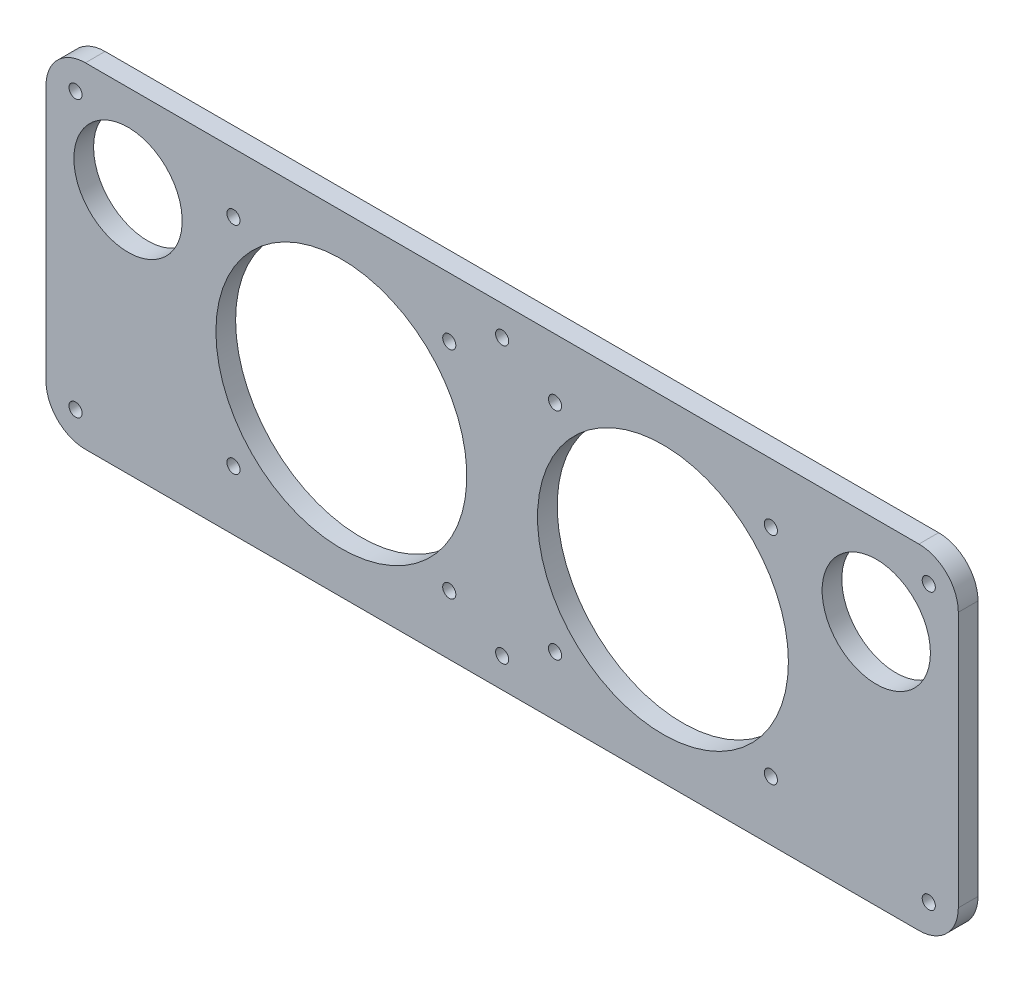
ISO-10303-21;
HEADER;
FILE_DESCRIPTION(('STEP AP214'),'2;1');
FILE_NAME('part.step','',(''),(''),'','','');
FILE_SCHEMA(('AUTOMOTIVE_DESIGN { 1 0 10303 214 1 1 1 1 }'));
ENDSEC;
DATA;
#1=APPLICATION_CONTEXT('core data for automotive mechanical design processes');
#2=APPLICATION_PROTOCOL_DEFINITION('international standard','automotive_design',2000,#1);
#3=PRODUCT_CONTEXT('',#1,'mechanical');
#4=PRODUCT('Part','Part','',(#3));
#5=PRODUCT_RELATED_PRODUCT_CATEGORY('part','',(#4));
#6=PRODUCT_DEFINITION_FORMATION('','',#4);
#7=PRODUCT_DEFINITION_CONTEXT('part definition',#1,'design');
#8=PRODUCT_DEFINITION('design','',#6,#7);
#9=PRODUCT_DEFINITION_SHAPE('','',#8);
#10=(LENGTH_UNIT() NAMED_UNIT(*) SI_UNIT(.MILLI.,.METRE.));
#11=(NAMED_UNIT(*) PLANE_ANGLE_UNIT() SI_UNIT($,.RADIAN.));
#12=(NAMED_UNIT(*) SI_UNIT($,.STERADIAN.) SOLID_ANGLE_UNIT());
#13=UNCERTAINTY_MEASURE_WITH_UNIT(LENGTH_MEASURE(1.E-05),#10,'distance_accuracy_value','');
#14=(GEOMETRIC_REPRESENTATION_CONTEXT(3) GLOBAL_UNCERTAINTY_ASSIGNED_CONTEXT((#13)) GLOBAL_UNIT_ASSIGNED_CONTEXT((#10,
#11,#12)) REPRESENTATION_CONTEXT('',''));
#15=CARTESIAN_POINT('',(0.,0.,0.));
#16=DIRECTION('',(0.,0.,1.));
#17=DIRECTION('',(1.,0.,0.));
#18=AXIS2_PLACEMENT_3D('',#15,#16,#17);
#19=CARTESIAN_POINT('',(-2.99999999999999,51.,-6.));
#20=DIRECTION('',(0.,1.,0.));
#21=DIRECTION('',(0.,0.,1.));
#22=AXIS2_PLACEMENT_3D('',#19,#20,#21);
#23=PLANE('',#22);
#24=DIRECTION('',(-1.,0.,0.));
#25=VECTOR('',#24,1.);
#26=CARTESIAN_POINT('',(-2.99999999999999,51.,-6.));
#27=LINE('',#26,#25);
#28=CARTESIAN_POINT('',(127.,51.,-6.));
#29=VERTEX_POINT('',#28);
#30=CARTESIAN_POINT('',(-127.,51.,-6.));
#31=VERTEX_POINT('',#30);
#32=EDGE_CURVE('E103',#29,#31,#27,.T.);
#33=ORIENTED_EDGE('',*,*,#32,.T.);
#34=DIRECTION('',(0.,0.,1.));
#35=VECTOR('',#34,1.);
#36=CARTESIAN_POINT('',(-127.,51.,-6.));
#37=LINE('',#36,#35);
#38=CARTESIAN_POINT('',(-127.,51.,0.));
#39=VERTEX_POINT('',#38);
#40=EDGE_CURVE('E109',#31,#39,#37,.T.);
#41=ORIENTED_EDGE('',*,*,#40,.T.);
#42=DIRECTION('',(-1.,0.,0.));
#43=VECTOR('',#42,1.);
#44=CARTESIAN_POINT('',(-2.99999999999999,51.,0.));
#45=LINE('',#44,#43);
#46=CARTESIAN_POINT('',(127.,51.,0.));
#47=VERTEX_POINT('',#46);
#48=EDGE_CURVE('E106',#47,#39,#45,.T.);
#49=ORIENTED_EDGE('',*,*,#48,.F.);
#50=DIRECTION('',(0.,0.,1.));
#51=VECTOR('',#50,1.);
#52=CARTESIAN_POINT('',(127.,51.,-6.));
#53=LINE('',#52,#51);
#54=EDGE_CURVE('E100',#47,#29,#53,.F.);
#55=ORIENTED_EDGE('',*,*,#54,.T.);
#56=EDGE_LOOP('',(#33,#41,#49,#55));
#57=FACE_BOUND('',#56,.T.);
#58=ADVANCED_FACE('F33',(#57),#23,.T.);
#59=CARTESIAN_POINT('',(139.,51.,-6.));
#60=DIRECTION('',(1.,0.,0.));
#61=DIRECTION('',(0.,0.,-1.));
#62=AXIS2_PLACEMENT_3D('',#59,#60,#61);
#63=PLANE('',#62);
#64=DIRECTION('',(0.,1.,0.));
#65=VECTOR('',#64,1.);
#66=CARTESIAN_POINT('',(139.,51.,0.));
#67=LINE('',#66,#65);
#68=CARTESIAN_POINT('',(139.,-39.,0.));
#69=VERTEX_POINT('',#68);
#70=CARTESIAN_POINT('',(139.,39.,0.));
#71=VERTEX_POINT('',#70);
#72=EDGE_CURVE('E139',#69,#71,#67,.T.);
#73=ORIENTED_EDGE('',*,*,#72,.F.);
#74=DIRECTION('',(0.,0.,1.));
#75=VECTOR('',#74,1.);
#76=CARTESIAN_POINT('',(139.,-39.,-6.));
#77=LINE('',#76,#75);
#78=CARTESIAN_POINT('',(139.,-39.,-6.));
#79=VERTEX_POINT('',#78);
#80=EDGE_CURVE('E11',#69,#79,#77,.F.);
#81=ORIENTED_EDGE('',*,*,#80,.T.);
#82=DIRECTION('',(0.,1.,0.));
#83=VECTOR('',#82,1.);
#84=CARTESIAN_POINT('',(139.,51.,-6.));
#85=LINE('',#84,#83);
#86=CARTESIAN_POINT('',(139.,39.,-6.));
#87=VERTEX_POINT('',#86);
#88=EDGE_CURVE('E118',#79,#87,#85,.T.);
#89=ORIENTED_EDGE('',*,*,#88,.T.);
#90=DIRECTION('',(0.,0.,1.));
#91=VECTOR('',#90,1.);
#92=CARTESIAN_POINT('',(139.,39.,-6.));
#93=LINE('',#92,#91);
#94=EDGE_CURVE('E41',#87,#71,#93,.T.);
#95=ORIENTED_EDGE('',*,*,#94,.T.);
#96=EDGE_LOOP('',(#73,#81,#89,#95));
#97=FACE_BOUND('',#96,.T.);
#98=ADVANCED_FACE('F138',(#97),#63,.T.);
#99=CARTESIAN_POINT('',(-2.99999999999999,-51.,-6.));
#100=DIRECTION('',(0.,-1.,0.));
#101=DIRECTION('',(0.,0.,-1.));
#102=AXIS2_PLACEMENT_3D('',#99,#100,#101);
#103=PLANE('',#102);
#104=DIRECTION('',(1.,0.,0.));
#105=VECTOR('',#104,1.);
#106=CARTESIAN_POINT('',(-2.99999999999999,-51.,0.));
#107=LINE('',#106,#105);
#108=CARTESIAN_POINT('',(-127.,-51.,0.));
#109=VERTEX_POINT('',#108);
#110=CARTESIAN_POINT('',(127.,-51.,0.));
#111=VERTEX_POINT('',#110);
#112=EDGE_CURVE('E147',#109,#111,#107,.T.);
#113=ORIENTED_EDGE('',*,*,#112,.F.);
#114=DIRECTION('',(0.,0.,1.));
#115=VECTOR('',#114,1.);
#116=CARTESIAN_POINT('',(-127.,-51.,-6.));
#117=LINE('',#116,#115);
#118=CARTESIAN_POINT('',(-127.,-51.,-6.));
#119=VERTEX_POINT('',#118);
#120=EDGE_CURVE('E55',#109,#119,#117,.F.);
#121=ORIENTED_EDGE('',*,*,#120,.T.);
#122=DIRECTION('',(1.,0.,0.));
#123=VECTOR('',#122,1.);
#124=CARTESIAN_POINT('',(-2.99999999999999,-51.,-6.));
#125=LINE('',#124,#123);
#126=CARTESIAN_POINT('',(127.,-51.,-6.));
#127=VERTEX_POINT('',#126);
#128=EDGE_CURVE('E149',#119,#127,#125,.T.);
#129=ORIENTED_EDGE('',*,*,#128,.T.);
#130=DIRECTION('',(0.,0.,1.));
#131=VECTOR('',#130,1.);
#132=CARTESIAN_POINT('',(127.,-51.,-6.));
#133=LINE('',#132,#131);
#134=EDGE_CURVE('E132',#127,#111,#133,.T.);
#135=ORIENTED_EDGE('',*,*,#134,.T.);
#136=EDGE_LOOP('',(#113,#121,#129,#135));
#137=FACE_BOUND('',#136,.T.);
#138=ADVANCED_FACE('F217',(#137),#103,.T.);
#139=CARTESIAN_POINT('',(0.,0.,-6.));
#140=DIRECTION('',(0.,0.,1.));
#141=DIRECTION('',(1.,0.,0.));
#142=AXIS2_PLACEMENT_3D('',#139,#140,#141);
#143=PLANE('',#142);
#144=CARTESIAN_POINT('',(-130.,42.,-6.));
#145=DIRECTION('',(0.,0.,1.));
#146=DIRECTION('',(1.,0.,0.));
#147=AXIS2_PLACEMENT_3D('',#144,#145,#146);
#148=CIRCLE('',#147,2.);
#149=CARTESIAN_POINT('',(-128.,42.,-6.));
#150=VERTEX_POINT('',#149);
#151=EDGE_CURVE('E309',#150,#150,#148,.T.);
#152=ORIENTED_EDGE('',*,*,#151,.T.);
#153=EDGE_LOOP('',(#152));
#154=FACE_BOUND('',#153,.T.);
#155=CARTESIAN_POINT('',(130.,-42.,-6.));
#156=DIRECTION('',(0.,0.,1.));
#157=DIRECTION('',(1.,0.,0.));
#158=AXIS2_PLACEMENT_3D('',#155,#156,#157);
#159=CIRCLE('',#158,2.);
#160=CARTESIAN_POINT('',(132.,-42.,-6.));
#161=VERTEX_POINT('',#160);
#162=EDGE_CURVE('E313',#161,#161,#159,.T.);
#163=ORIENTED_EDGE('',*,*,#162,.T.);
#164=EDGE_LOOP('',(#163));
#165=FACE_BOUND('',#164,.T.);
#166=CARTESIAN_POINT('',(-130.,-42.,-6.));
#167=DIRECTION('',(0.,0.,1.));
#168=DIRECTION('',(1.,0.,0.));
#169=AXIS2_PLACEMENT_3D('',#166,#167,#168);
#170=CIRCLE('',#169,2.);
#171=CARTESIAN_POINT('',(-128.,-42.,-6.));
#172=VERTEX_POINT('',#171);
#173=EDGE_CURVE('E317',#172,#172,#170,.T.);
#174=ORIENTED_EDGE('',*,*,#173,.T.);
#175=EDGE_LOOP('',(#174));
#176=FACE_BOUND('',#175,.T.);
#177=CARTESIAN_POINT('',(130.,42.,-6.));
#178=DIRECTION('',(0.,0.,1.));
#179=DIRECTION('',(1.,0.,0.));
#180=AXIS2_PLACEMENT_3D('',#177,#178,#179);
#181=CIRCLE('',#180,2.);
#182=CARTESIAN_POINT('',(132.,42.,-6.));
#183=VERTEX_POINT('',#182);
#184=EDGE_CURVE('E321',#183,#183,#181,.T.);
#185=ORIENTED_EDGE('',*,*,#184,.T.);
#186=EDGE_LOOP('',(#185));
#187=FACE_BOUND('',#186,.T.);
#188=CARTESIAN_POINT('',(0.,42.,-6.));
#189=DIRECTION('',(0.,0.,1.));
#190=DIRECTION('',(1.,0.,0.));
#191=AXIS2_PLACEMENT_3D('',#188,#189,#190);
#192=CIRCLE('',#191,2.);
#193=CARTESIAN_POINT('',(2.00000000000001,42.,-6.));
#194=VERTEX_POINT('',#193);
#195=EDGE_CURVE('E325',#194,#194,#192,.T.);
#196=ORIENTED_EDGE('',*,*,#195,.T.);
#197=EDGE_LOOP('',(#196));
#198=FACE_BOUND('',#197,.T.);
#199=CARTESIAN_POINT('',(0.,-42.,-6.));
#200=DIRECTION('',(0.,0.,1.));
#201=DIRECTION('',(1.,0.,0.));
#202=AXIS2_PLACEMENT_3D('',#199,#200,#201);
#203=CIRCLE('',#202,2.);
#204=CARTESIAN_POINT('',(2.00000000000001,-42.,-6.));
#205=VERTEX_POINT('',#204);
#206=EDGE_CURVE('E329',#205,#205,#203,.T.);
#207=ORIENTED_EDGE('',*,*,#206,.T.);
#208=EDGE_LOOP('',(#207));
#209=FACE_BOUND('',#208,.T.);
#210=CARTESIAN_POINT('',(114.,24.,-6.));
#211=DIRECTION('',(0.,0.,1.));
#212=DIRECTION('',(1.,0.,0.));
#213=AXIS2_PLACEMENT_3D('',#210,#211,#212);
#214=CIRCLE('',#213,16.5);
#215=CARTESIAN_POINT('',(130.5,24.,-6.));
#216=VERTEX_POINT('',#215);
#217=EDGE_CURVE('E181',#216,#216,#214,.T.);
#218=ORIENTED_EDGE('',*,*,#217,.T.);
#219=EDGE_LOOP('',(#218));
#220=FACE_BOUND('',#219,.T.);
#221=CARTESIAN_POINT('',(16.1195346748253,32.8804653251742,-6.));
#222=DIRECTION('',(0.,0.,1.));
#223=DIRECTION('',(0.,1.,0.));
#224=AXIS2_PLACEMENT_3D('',#221,#222,#223);
#225=CIRCLE('',#224,2.);
#226=CARTESIAN_POINT('',(16.1195346748252,34.8804653251742,-6.));
#227=VERTEX_POINT('',#226);
#228=EDGE_CURVE('E187',#227,#227,#225,.T.);
#229=ORIENTED_EDGE('',*,*,#228,.T.);
#230=EDGE_LOOP('',(#229));
#231=FACE_BOUND('',#230,.T.);
#232=CARTESIAN_POINT('',(16.1195346748257,-32.8804653251746,-6.));
#233=DIRECTION('',(0.,0.,1.));
#234=DIRECTION('',(-1.,0.,0.));
#235=AXIS2_PLACEMENT_3D('',#232,#233,#234);
#236=CIRCLE('',#235,2.);
#237=CARTESIAN_POINT('',(14.1195346748257,-32.8804653251746,-6.));
#238=VERTEX_POINT('',#237);
#239=EDGE_CURVE('E194',#238,#238,#236,.T.);
#240=ORIENTED_EDGE('',*,*,#239,.T.);
#241=EDGE_LOOP('',(#240));
#242=FACE_BOUND('',#241,.T.);
#243=CARTESIAN_POINT('',(81.880465325175,-32.8804653251739,-6.));
#244=DIRECTION('',(0.,0.,1.));
#245=DIRECTION('',(0.,-1.,0.));
#246=AXIS2_PLACEMENT_3D('',#243,#244,#245);
#247=CIRCLE('',#246,2.);
#248=CARTESIAN_POINT('',(81.880465325175,-34.8804653251739,-6.));
#249=VERTEX_POINT('',#248);
#250=EDGE_CURVE('E200',#249,#249,#247,.T.);
#251=ORIENTED_EDGE('',*,*,#250,.T.);
#252=EDGE_LOOP('',(#251));
#253=FACE_BOUND('',#252,.T.);
#254=CARTESIAN_POINT('',(81.8804653251743,32.8804653251746,-6.));
#255=DIRECTION('',(0.,0.,1.));
#256=DIRECTION('',(1.,0.,0.));
#257=AXIS2_PLACEMENT_3D('',#254,#255,#256);
#258=CIRCLE('',#257,2.);
#259=CARTESIAN_POINT('',(83.8804653251743,32.8804653251746,-6.));
#260=VERTEX_POINT('',#259);
#261=EDGE_CURVE('E205',#260,#260,#258,.T.);
#262=ORIENTED_EDGE('',*,*,#261,.T.);
#263=EDGE_LOOP('',(#262));
#264=FACE_BOUND('',#263,.T.);
#265=CARTESIAN_POINT('',(49.,0.,-6.));
#266=DIRECTION('',(0.,0.,1.));
#267=DIRECTION('',(1.,0.,0.));
#268=AXIS2_PLACEMENT_3D('',#265,#266,#267);
#269=CIRCLE('',#268,38.227);
#270=CARTESIAN_POINT('',(87.227,0.,-6.));
#271=VERTEX_POINT('',#270);
#272=EDGE_CURVE('E151',#271,#271,#269,.T.);
#273=ORIENTED_EDGE('',*,*,#272,.T.);
#274=EDGE_LOOP('',(#273));
#275=FACE_BOUND('',#274,.T.);
#276=DIRECTION('',(0.,1.,0.));
#277=VECTOR('',#276,1.);
#278=CARTESIAN_POINT('',(-139.,51.,-6.));
#279=LINE('',#278,#277);
#280=CARTESIAN_POINT('',(-139.,-39.,-6.));
#281=VERTEX_POINT('',#280);
#282=CARTESIAN_POINT('',(-139.,39.,-6.));
#283=VERTEX_POINT('',#282);
#284=EDGE_CURVE('E169',#281,#283,#279,.T.);
#285=ORIENTED_EDGE('',*,*,#284,.T.);
#286=CARTESIAN_POINT('',(-127.,39.,-6.));
#287=DIRECTION('',(0.,0.,1.));
#288=DIRECTION('',(1.,0.,0.));
#289=AXIS2_PLACEMENT_3D('',#286,#287,#288);
#290=CIRCLE('',#289,12.);
#291=EDGE_CURVE('E117',#283,#31,#290,.F.);
#292=ORIENTED_EDGE('',*,*,#291,.T.);
#293=ORIENTED_EDGE('',*,*,#32,.F.);
#294=CARTESIAN_POINT('',(127.,39.,-6.));
#295=DIRECTION('',(0.,0.,1.));
#296=DIRECTION('',(1.,0.,0.));
#297=AXIS2_PLACEMENT_3D('',#294,#295,#296);
#298=CIRCLE('',#297,12.);
#299=EDGE_CURVE('E114',#29,#87,#298,.F.);
#300=ORIENTED_EDGE('',*,*,#299,.T.);
#301=ORIENTED_EDGE('',*,*,#88,.F.);
#302=CARTESIAN_POINT('',(127.,-39.,-6.));
#303=DIRECTION('',(0.,0.,1.));
#304=DIRECTION('',(1.,0.,0.));
#305=AXIS2_PLACEMENT_3D('',#302,#303,#304);
#306=CIRCLE('',#305,12.);
#307=EDGE_CURVE('E48',#79,#127,#306,.F.);
#308=ORIENTED_EDGE('',*,*,#307,.T.);
#309=ORIENTED_EDGE('',*,*,#128,.F.);
#310=CARTESIAN_POINT('',(-127.,-39.,-6.));
#311=DIRECTION('',(0.,0.,1.));
#312=DIRECTION('',(1.,0.,0.));
#313=AXIS2_PLACEMENT_3D('',#310,#311,#312);
#314=CIRCLE('',#313,12.);
#315=EDGE_CURVE('E124',#119,#281,#314,.F.);
#316=ORIENTED_EDGE('',*,*,#315,.T.);
#317=EDGE_LOOP('',(#285,#292,#293,#300,#301,#308,#309,#316));
#318=FACE_BOUND('',#317,.T.);
#319=CARTESIAN_POINT('',(-114.,24.,-6.));
#320=DIRECTION('',(0.,0.,-1.));
#321=DIRECTION('',(-1.,0.,0.));
#322=AXIS2_PLACEMENT_3D('',#319,#320,#321);
#323=CIRCLE('',#322,16.5);
#324=CARTESIAN_POINT('',(-130.5,24.,-6.));
#325=VERTEX_POINT('',#324);
#326=EDGE_CURVE('E376',#325,#325,#323,.T.);
#327=ORIENTED_EDGE('',*,*,#326,.F.);
#328=EDGE_LOOP('',(#327));
#329=FACE_BOUND('',#328,.T.);
#330=CARTESIAN_POINT('',(-16.1195346748253,32.8804653251742,-6.));
#331=DIRECTION('',(0.,0.,-1.));
#332=DIRECTION('',(0.,1.,0.));
#333=AXIS2_PLACEMENT_3D('',#330,#331,#332);
#334=CIRCLE('',#333,2.);
#335=CARTESIAN_POINT('',(-16.1195346748252,34.8804653251742,-6.));
#336=VERTEX_POINT('',#335);
#337=EDGE_CURVE('E372',#336,#336,#334,.T.);
#338=ORIENTED_EDGE('',*,*,#337,.F.);
#339=EDGE_LOOP('',(#338));
#340=FACE_BOUND('',#339,.T.);
#341=CARTESIAN_POINT('',(-16.1195346748257,-32.8804653251746,-6.));
#342=DIRECTION('',(0.,0.,-1.));
#343=DIRECTION('',(1.,0.,0.));
#344=AXIS2_PLACEMENT_3D('',#341,#342,#343);
#345=CIRCLE('',#344,2.);
#346=CARTESIAN_POINT('',(-14.1195346748257,-32.8804653251746,-6.));
#347=VERTEX_POINT('',#346);
#348=EDGE_CURVE('E380',#347,#347,#345,.T.);
#349=ORIENTED_EDGE('',*,*,#348,.F.);
#350=EDGE_LOOP('',(#349));
#351=FACE_BOUND('',#350,.T.);
#352=CARTESIAN_POINT('',(-81.880465325175,-32.8804653251739,-6.));
#353=DIRECTION('',(0.,0.,-1.));
#354=DIRECTION('',(0.,-1.,0.));
#355=AXIS2_PLACEMENT_3D('',#352,#353,#354);
#356=CIRCLE('',#355,2.);
#357=CARTESIAN_POINT('',(-81.880465325175,-34.8804653251739,-6.));
#358=VERTEX_POINT('',#357);
#359=EDGE_CURVE('E375',#358,#358,#356,.T.);
#360=ORIENTED_EDGE('',*,*,#359,.F.);
#361=EDGE_LOOP('',(#360));
#362=FACE_BOUND('',#361,.T.);
#363=CARTESIAN_POINT('',(-81.8804653251743,32.8804653251746,-6.));
#364=DIRECTION('',(0.,0.,-1.));
#365=DIRECTION('',(-1.,0.,0.));
#366=AXIS2_PLACEMENT_3D('',#363,#364,#365);
#367=CIRCLE('',#366,2.);
#368=CARTESIAN_POINT('',(-83.8804653251743,32.8804653251746,-6.));
#369=VERTEX_POINT('',#368);
#370=EDGE_CURVE('E368',#369,#369,#367,.T.);
#371=ORIENTED_EDGE('',*,*,#370,.F.);
#372=EDGE_LOOP('',(#371));
#373=FACE_BOUND('',#372,.T.);
#374=CARTESIAN_POINT('',(-49.,0.,-6.));
#375=DIRECTION('',(0.,0.,-1.));
#376=DIRECTION('',(-1.,0.,0.));
#377=AXIS2_PLACEMENT_3D('',#374,#375,#376);
#378=CIRCLE('',#377,38.227);
#379=CARTESIAN_POINT('',(-87.227,0.,-6.));
#380=VERTEX_POINT('',#379);
#381=EDGE_CURVE('E172',#380,#380,#378,.T.);
#382=ORIENTED_EDGE('',*,*,#381,.F.);
#383=EDGE_LOOP('',(#382));
#384=FACE_BOUND('',#383,.T.);
#385=ADVANCED_FACE('F112',(#154,#165,#176,#187,#198,#209,#220,#231,#242,#253,#264,#275,#318,
#329,#340,#351,#362,#373,#384),#143,.F.);
#386=CARTESIAN_POINT('',(0.,0.,0.));
#387=DIRECTION('',(0.,0.,1.));
#388=DIRECTION('',(1.,0.,0.));
#389=AXIS2_PLACEMENT_3D('',#386,#387,#388);
#390=PLANE('',#389);
#391=CARTESIAN_POINT('',(-130.,42.,0.));
#392=DIRECTION('',(0.,0.,1.));
#393=DIRECTION('',(1.,0.,0.));
#394=AXIS2_PLACEMENT_3D('',#391,#392,#393);
#395=CIRCLE('',#394,2.);
#396=CARTESIAN_POINT('',(-128.,42.,0.));
#397=VERTEX_POINT('',#396);
#398=EDGE_CURVE('E409',#397,#397,#395,.T.);
#399=ORIENTED_EDGE('',*,*,#398,.F.);
#400=EDGE_LOOP('',(#399));
#401=FACE_BOUND('',#400,.T.);
#402=CARTESIAN_POINT('',(130.,-42.,0.));
#403=DIRECTION('',(0.,0.,1.));
#404=DIRECTION('',(1.,0.,0.));
#405=AXIS2_PLACEMENT_3D('',#402,#403,#404);
#406=CIRCLE('',#405,2.);
#407=CARTESIAN_POINT('',(132.,-42.,0.));
#408=VERTEX_POINT('',#407);
#409=EDGE_CURVE('E405',#408,#408,#406,.T.);
#410=ORIENTED_EDGE('',*,*,#409,.F.);
#411=EDGE_LOOP('',(#410));
#412=FACE_BOUND('',#411,.T.);
#413=CARTESIAN_POINT('',(-130.,-42.,0.));
#414=DIRECTION('',(0.,0.,1.));
#415=DIRECTION('',(1.,0.,0.));
#416=AXIS2_PLACEMENT_3D('',#413,#414,#415);
#417=CIRCLE('',#416,2.);
#418=CARTESIAN_POINT('',(-128.,-42.,0.));
#419=VERTEX_POINT('',#418);
#420=EDGE_CURVE('E401',#419,#419,#417,.T.);
#421=ORIENTED_EDGE('',*,*,#420,.F.);
#422=EDGE_LOOP('',(#421));
#423=FACE_BOUND('',#422,.T.);
#424=CARTESIAN_POINT('',(130.,42.,0.));
#425=DIRECTION('',(0.,0.,1.));
#426=DIRECTION('',(1.,0.,0.));
#427=AXIS2_PLACEMENT_3D('',#424,#425,#426);
#428=CIRCLE('',#427,2.);
#429=CARTESIAN_POINT('',(132.,42.,0.));
#430=VERTEX_POINT('',#429);
#431=EDGE_CURVE('E397',#430,#430,#428,.T.);
#432=ORIENTED_EDGE('',*,*,#431,.F.);
#433=EDGE_LOOP('',(#432));
#434=FACE_BOUND('',#433,.T.);
#435=CARTESIAN_POINT('',(0.,42.,0.));
#436=DIRECTION('',(0.,0.,1.));
#437=DIRECTION('',(1.,0.,0.));
#438=AXIS2_PLACEMENT_3D('',#435,#436,#437);
#439=CIRCLE('',#438,1.99999999999999);
#440=CARTESIAN_POINT('',(2.,42.,0.));
#441=VERTEX_POINT('',#440);
#442=EDGE_CURVE('E393',#441,#441,#439,.T.);
#443=ORIENTED_EDGE('',*,*,#442,.F.);
#444=EDGE_LOOP('',(#443));
#445=FACE_BOUND('',#444,.T.);
#446=CARTESIAN_POINT('',(0.,-42.,0.));
#447=DIRECTION('',(0.,0.,1.));
#448=DIRECTION('',(1.,0.,0.));
#449=AXIS2_PLACEMENT_3D('',#446,#447,#448);
#450=CIRCLE('',#449,1.99999999999999);
#451=CARTESIAN_POINT('',(2.,-42.,0.));
#452=VERTEX_POINT('',#451);
#453=EDGE_CURVE('E389',#452,#452,#450,.T.);
#454=ORIENTED_EDGE('',*,*,#453,.F.);
#455=EDGE_LOOP('',(#454));
#456=FACE_BOUND('',#455,.T.);
#457=ORIENTED_EDGE('',*,*,#48,.T.);
#458=CARTESIAN_POINT('',(-127.,39.,0.));
#459=DIRECTION('',(0.,0.,1.));
#460=DIRECTION('',(1.,0.,0.));
#461=AXIS2_PLACEMENT_3D('',#458,#459,#460);
#462=CIRCLE('',#461,12.);
#463=CARTESIAN_POINT('',(-139.,39.,0.));
#464=VERTEX_POINT('',#463);
#465=EDGE_CURVE('E159',#39,#464,#462,.T.);
#466=ORIENTED_EDGE('',*,*,#465,.T.);
#467=DIRECTION('',(0.,1.,0.));
#468=VECTOR('',#467,1.);
#469=CARTESIAN_POINT('',(-139.,51.,0.));
#470=LINE('',#469,#468);
#471=CARTESIAN_POINT('',(-139.,-39.,0.));
#472=VERTEX_POINT('',#471);
#473=EDGE_CURVE('E167',#472,#464,#470,.T.);
#474=ORIENTED_EDGE('',*,*,#473,.F.);
#475=CARTESIAN_POINT('',(-127.,-39.,0.));
#476=DIRECTION('',(0.,0.,1.));
#477=DIRECTION('',(1.,0.,0.));
#478=AXIS2_PLACEMENT_3D('',#475,#476,#477);
#479=CIRCLE('',#478,12.);
#480=EDGE_CURVE('E157',#472,#109,#479,.T.);
#481=ORIENTED_EDGE('',*,*,#480,.T.);
#482=ORIENTED_EDGE('',*,*,#112,.T.);
#483=CARTESIAN_POINT('',(127.,-39.,0.));
#484=DIRECTION('',(0.,0.,1.));
#485=DIRECTION('',(1.,0.,0.));
#486=AXIS2_PLACEMENT_3D('',#483,#484,#485);
#487=CIRCLE('',#486,12.);
#488=EDGE_CURVE('E146',#111,#69,#487,.T.);
#489=ORIENTED_EDGE('',*,*,#488,.T.);
#490=ORIENTED_EDGE('',*,*,#72,.T.);
#491=CARTESIAN_POINT('',(127.,39.,0.));
#492=DIRECTION('',(0.,0.,1.));
#493=DIRECTION('',(1.,0.,0.));
#494=AXIS2_PLACEMENT_3D('',#491,#492,#493);
#495=CIRCLE('',#494,12.);
#496=EDGE_CURVE('E144',#71,#47,#495,.T.);
#497=ORIENTED_EDGE('',*,*,#496,.T.);
#498=EDGE_LOOP('',(#457,#466,#474,#481,#482,#489,#490,#497));
#499=FACE_BOUND('',#498,.T.);
#500=CARTESIAN_POINT('',(114.,24.,0.));
#501=DIRECTION('',(0.,0.,1.));
#502=DIRECTION('',(1.,0.,0.));
#503=AXIS2_PLACEMENT_3D('',#500,#501,#502);
#504=CIRCLE('',#503,16.5);
#505=CARTESIAN_POINT('',(130.5,24.,0.));
#506=VERTEX_POINT('',#505);
#507=EDGE_CURVE('E174',#506,#506,#504,.T.);
#508=ORIENTED_EDGE('',*,*,#507,.F.);
#509=EDGE_LOOP('',(#508));
#510=FACE_BOUND('',#509,.T.);
#511=CARTESIAN_POINT('',(16.1195346748253,32.8804653251742,0.));
#512=DIRECTION('',(0.,0.,1.));
#513=DIRECTION('',(0.,1.,0.));
#514=AXIS2_PLACEMENT_3D('',#511,#512,#513);
#515=CIRCLE('',#514,2.);
#516=CARTESIAN_POINT('',(16.1195346748252,34.8804653251742,0.));
#517=VERTEX_POINT('',#516);
#518=EDGE_CURVE('E191',#517,#517,#515,.T.);
#519=ORIENTED_EDGE('',*,*,#518,.F.);
#520=EDGE_LOOP('',(#519));
#521=FACE_BOUND('',#520,.T.);
#522=CARTESIAN_POINT('',(16.1195346748257,-32.8804653251746,0.));
#523=DIRECTION('',(0.,0.,1.));
#524=DIRECTION('',(-1.,0.,0.));
#525=AXIS2_PLACEMENT_3D('',#522,#523,#524);
#526=CIRCLE('',#525,2.);
#527=CARTESIAN_POINT('',(14.1195346748257,-32.8804653251746,0.));
#528=VERTEX_POINT('',#527);
#529=EDGE_CURVE('E197',#528,#528,#526,.T.);
#530=ORIENTED_EDGE('',*,*,#529,.F.);
#531=EDGE_LOOP('',(#530));
#532=FACE_BOUND('',#531,.T.);
#533=CARTESIAN_POINT('',(81.880465325175,-32.8804653251739,0.));
#534=DIRECTION('',(0.,0.,1.));
#535=DIRECTION('',(0.,-1.,0.));
#536=AXIS2_PLACEMENT_3D('',#533,#534,#535);
#537=CIRCLE('',#536,2.);
#538=CARTESIAN_POINT('',(81.880465325175,-34.8804653251739,0.));
#539=VERTEX_POINT('',#538);
#540=EDGE_CURVE('E184',#539,#539,#537,.T.);
#541=ORIENTED_EDGE('',*,*,#540,.F.);
#542=EDGE_LOOP('',(#541));
#543=FACE_BOUND('',#542,.T.);
#544=CARTESIAN_POINT('',(81.8804653251743,32.8804653251746,0.));
#545=DIRECTION('',(0.,0.,1.));
#546=DIRECTION('',(1.,0.,0.));
#547=AXIS2_PLACEMENT_3D('',#544,#545,#546);
#548=CIRCLE('',#547,2.);
#549=CARTESIAN_POINT('',(83.8804653251743,32.8804653251746,0.));
#550=VERTEX_POINT('',#549);
#551=EDGE_CURVE('E190',#550,#550,#548,.T.);
#552=ORIENTED_EDGE('',*,*,#551,.F.);
#553=EDGE_LOOP('',(#552));
#554=FACE_BOUND('',#553,.T.);
#555=CARTESIAN_POINT('',(49.,0.,0.));
#556=DIRECTION('',(0.,0.,1.));
#557=DIRECTION('',(1.,0.,0.));
#558=AXIS2_PLACEMENT_3D('',#555,#556,#557);
#559=CIRCLE('',#558,38.227);
#560=CARTESIAN_POINT('',(87.227,0.,0.));
#561=VERTEX_POINT('',#560);
#562=EDGE_CURVE('E208',#561,#561,#559,.T.);
#563=ORIENTED_EDGE('',*,*,#562,.F.);
#564=EDGE_LOOP('',(#563));
#565=FACE_BOUND('',#564,.T.);
#566=CARTESIAN_POINT('',(-114.,24.,0.));
#567=DIRECTION('',(0.,0.,-1.));
#568=DIRECTION('',(-1.,0.,0.));
#569=AXIS2_PLACEMENT_3D('',#566,#567,#568);
#570=CIRCLE('',#569,16.5);
#571=CARTESIAN_POINT('',(-130.5,24.,0.));
#572=VERTEX_POINT('',#571);
#573=EDGE_CURVE('E348',#572,#572,#570,.T.);
#574=ORIENTED_EDGE('',*,*,#573,.T.);
#575=EDGE_LOOP('',(#574));
#576=FACE_BOUND('',#575,.T.);
#577=CARTESIAN_POINT('',(-16.1195346748253,32.8804653251742,0.));
#578=DIRECTION('',(0.,0.,-1.));
#579=DIRECTION('',(0.,1.,0.));
#580=AXIS2_PLACEMENT_3D('',#577,#578,#579);
#581=CIRCLE('',#580,2.);
#582=CARTESIAN_POINT('',(-16.1195346748252,34.8804653251742,0.));
#583=VERTEX_POINT('',#582);
#584=EDGE_CURVE('E352',#583,#583,#581,.T.);
#585=ORIENTED_EDGE('',*,*,#584,.T.);
#586=EDGE_LOOP('',(#585));
#587=FACE_BOUND('',#586,.T.);
#588=CARTESIAN_POINT('',(-16.1195346748257,-32.8804653251746,0.));
#589=DIRECTION('',(0.,0.,-1.));
#590=DIRECTION('',(1.,0.,0.));
#591=AXIS2_PLACEMENT_3D('',#588,#589,#590);
#592=CIRCLE('',#591,2.);
#593=CARTESIAN_POINT('',(-14.1195346748257,-32.8804653251746,0.));
#594=VERTEX_POINT('',#593);
#595=EDGE_CURVE('E356',#594,#594,#592,.T.);
#596=ORIENTED_EDGE('',*,*,#595,.T.);
#597=EDGE_LOOP('',(#596));
#598=FACE_BOUND('',#597,.T.);
#599=CARTESIAN_POINT('',(-81.880465325175,-32.8804653251739,0.));
#600=DIRECTION('',(0.,0.,-1.));
#601=DIRECTION('',(0.,-1.,0.));
#602=AXIS2_PLACEMENT_3D('',#599,#600,#601);
#603=CIRCLE('',#602,2.);
#604=CARTESIAN_POINT('',(-81.880465325175,-34.8804653251739,0.));
#605=VERTEX_POINT('',#604);
#606=EDGE_CURVE('E360',#605,#605,#603,.T.);
#607=ORIENTED_EDGE('',*,*,#606,.T.);
#608=EDGE_LOOP('',(#607));
#609=FACE_BOUND('',#608,.T.);
#610=CARTESIAN_POINT('',(-81.8804653251743,32.8804653251746,0.));
#611=DIRECTION('',(0.,0.,-1.));
#612=DIRECTION('',(-1.,0.,0.));
#613=AXIS2_PLACEMENT_3D('',#610,#611,#612);
#614=CIRCLE('',#613,2.);
#615=CARTESIAN_POINT('',(-83.8804653251743,32.8804653251746,0.));
#616=VERTEX_POINT('',#615);
#617=EDGE_CURVE('E364',#616,#616,#614,.T.);
#618=ORIENTED_EDGE('',*,*,#617,.T.);
#619=EDGE_LOOP('',(#618));
#620=FACE_BOUND('',#619,.T.);
#621=CARTESIAN_POINT('',(-49.,0.,0.));
#622=DIRECTION('',(0.,0.,-1.));
#623=DIRECTION('',(-1.,0.,0.));
#624=AXIS2_PLACEMENT_3D('',#621,#622,#623);
#625=CIRCLE('',#624,38.227);
#626=CARTESIAN_POINT('',(-87.227,0.,0.));
#627=VERTEX_POINT('',#626);
#628=EDGE_CURVE('E177',#627,#627,#625,.T.);
#629=ORIENTED_EDGE('',*,*,#628,.T.);
#630=EDGE_LOOP('',(#629));
#631=FACE_BOUND('',#630,.T.);
#632=ADVANCED_FACE('F142',(#401,#412,#423,#434,#445,#456,#499,#510,#521,#532,#543,#554,#565,
#576,#587,#598,#609,#620,#631),#390,.T.);
#633=CARTESIAN_POINT('',(49.,0.,-6.));
#634=DIRECTION('',(0.,0.,1.));
#635=DIRECTION('',(1.,0.,0.));
#636=AXIS2_PLACEMENT_3D('',#633,#634,#635);
#637=CYLINDRICAL_SURFACE('',#636,38.227);
#638=ORIENTED_EDGE('',*,*,#272,.F.);
#639=EDGE_LOOP('',(#638));
#640=FACE_BOUND('',#639,.T.);
#641=ORIENTED_EDGE('',*,*,#562,.T.);
#642=EDGE_LOOP('',(#641));
#643=FACE_BOUND('',#642,.T.);
#644=ADVANCED_FACE('F296',(#640,#643),#637,.F.);
#645=CARTESIAN_POINT('',(81.8804653251743,32.8804653251746,-6.));
#646=DIRECTION('',(0.,0.,1.));
#647=DIRECTION('',(1.,0.,0.));
#648=AXIS2_PLACEMENT_3D('',#645,#646,#647);
#649=CYLINDRICAL_SURFACE('',#648,2.);
#650=ORIENTED_EDGE('',*,*,#261,.F.);
#651=EDGE_LOOP('',(#650));
#652=FACE_BOUND('',#651,.T.);
#653=ORIENTED_EDGE('',*,*,#551,.T.);
#654=EDGE_LOOP('',(#653));
#655=FACE_BOUND('',#654,.T.);
#656=ADVANCED_FACE('F292',(#652,#655),#649,.F.);
#657=CARTESIAN_POINT('',(81.880465325175,-32.8804653251739,-6.));
#658=DIRECTION('',(0.,0.,1.));
#659=DIRECTION('',(1.,0.,0.));
#660=AXIS2_PLACEMENT_3D('',#657,#658,#659);
#661=CYLINDRICAL_SURFACE('',#660,2.);
#662=ORIENTED_EDGE('',*,*,#250,.F.);
#663=EDGE_LOOP('',(#662));
#664=FACE_BOUND('',#663,.T.);
#665=ORIENTED_EDGE('',*,*,#540,.T.);
#666=EDGE_LOOP('',(#665));
#667=FACE_BOUND('',#666,.T.);
#668=ADVANCED_FACE('F288',(#664,#667),#661,.F.);
#669=CARTESIAN_POINT('',(16.1195346748257,-32.8804653251746,-6.));
#670=DIRECTION('',(0.,0.,1.));
#671=DIRECTION('',(1.,0.,0.));
#672=AXIS2_PLACEMENT_3D('',#669,#670,#671);
#673=CYLINDRICAL_SURFACE('',#672,2.);
#674=ORIENTED_EDGE('',*,*,#239,.F.);
#675=EDGE_LOOP('',(#674));
#676=FACE_BOUND('',#675,.T.);
#677=ORIENTED_EDGE('',*,*,#529,.T.);
#678=EDGE_LOOP('',(#677));
#679=FACE_BOUND('',#678,.T.);
#680=ADVANCED_FACE('F284',(#676,#679),#673,.F.);
#681=CARTESIAN_POINT('',(16.1195346748253,32.8804653251742,-6.));
#682=DIRECTION('',(0.,0.,1.));
#683=DIRECTION('',(1.,0.,0.));
#684=AXIS2_PLACEMENT_3D('',#681,#682,#683);
#685=CYLINDRICAL_SURFACE('',#684,2.);
#686=ORIENTED_EDGE('',*,*,#228,.F.);
#687=EDGE_LOOP('',(#686));
#688=FACE_BOUND('',#687,.T.);
#689=ORIENTED_EDGE('',*,*,#518,.T.);
#690=EDGE_LOOP('',(#689));
#691=FACE_BOUND('',#690,.T.);
#692=ADVANCED_FACE('F280',(#688,#691),#685,.F.);
#693=CARTESIAN_POINT('',(114.,24.,-6.));
#694=DIRECTION('',(0.,0.,1.));
#695=DIRECTION('',(1.,0.,0.));
#696=AXIS2_PLACEMENT_3D('',#693,#694,#695);
#697=CYLINDRICAL_SURFACE('',#696,16.5);
#698=ORIENTED_EDGE('',*,*,#217,.F.);
#699=EDGE_LOOP('',(#698));
#700=FACE_BOUND('',#699,.T.);
#701=ORIENTED_EDGE('',*,*,#507,.T.);
#702=EDGE_LOOP('',(#701));
#703=FACE_BOUND('',#702,.T.);
#704=ADVANCED_FACE('F277',(#700,#703),#697,.F.);
#705=CARTESIAN_POINT('',(-139.,51.,-6.));
#706=DIRECTION('',(-1.,0.,0.));
#707=DIRECTION('',(0.,0.,-1.));
#708=AXIS2_PLACEMENT_3D('',#705,#706,#707);
#709=PLANE('',#708);
#710=ORIENTED_EDGE('',*,*,#473,.T.);
#711=DIRECTION('',(0.,0.,1.));
#712=VECTOR('',#711,1.);
#713=CARTESIAN_POINT('',(-139.,39.,-6.));
#714=LINE('',#713,#712);
#715=EDGE_CURVE('E122',#464,#283,#714,.F.);
#716=ORIENTED_EDGE('',*,*,#715,.T.);
#717=ORIENTED_EDGE('',*,*,#284,.F.);
#718=DIRECTION('',(0.,0.,1.));
#719=VECTOR('',#718,1.);
#720=CARTESIAN_POINT('',(-139.,-39.,-6.));
#721=LINE('',#720,#719);
#722=EDGE_CURVE('E126',#281,#472,#721,.T.);
#723=ORIENTED_EDGE('',*,*,#722,.T.);
#724=EDGE_LOOP('',(#710,#716,#717,#723));
#725=FACE_BOUND('',#724,.T.);
#726=ADVANCED_FACE('F166',(#725),#709,.T.);
#727=CARTESIAN_POINT('',(-49.,0.,-6.));
#728=DIRECTION('',(0.,0.,1.));
#729=DIRECTION('',(-1.,0.,0.));
#730=AXIS2_PLACEMENT_3D('',#727,#728,#729);
#731=CYLINDRICAL_SURFACE('',#730,38.227);
#732=ORIENTED_EDGE('',*,*,#381,.T.);
#733=EDGE_LOOP('',(#732));
#734=FACE_BOUND('',#733,.T.);
#735=ORIENTED_EDGE('',*,*,#628,.F.);
#736=EDGE_LOOP('',(#735));
#737=FACE_BOUND('',#736,.T.);
#738=ADVANCED_FACE('F270',(#734,#737),#731,.F.);
#739=CARTESIAN_POINT('',(-81.8804653251743,32.8804653251746,-6.));
#740=DIRECTION('',(0.,0.,1.));
#741=DIRECTION('',(-1.,0.,0.));
#742=AXIS2_PLACEMENT_3D('',#739,#740,#741);
#743=CYLINDRICAL_SURFACE('',#742,2.);
#744=ORIENTED_EDGE('',*,*,#370,.T.);
#745=EDGE_LOOP('',(#744));
#746=FACE_BOUND('',#745,.T.);
#747=ORIENTED_EDGE('',*,*,#617,.F.);
#748=EDGE_LOOP('',(#747));
#749=FACE_BOUND('',#748,.T.);
#750=ADVANCED_FACE('F266',(#746,#749),#743,.F.);
#751=CARTESIAN_POINT('',(-81.880465325175,-32.8804653251739,-6.));
#752=DIRECTION('',(0.,0.,1.));
#753=DIRECTION('',(-1.,0.,0.));
#754=AXIS2_PLACEMENT_3D('',#751,#752,#753);
#755=CYLINDRICAL_SURFACE('',#754,2.);
#756=ORIENTED_EDGE('',*,*,#359,.T.);
#757=EDGE_LOOP('',(#756));
#758=FACE_BOUND('',#757,.T.);
#759=ORIENTED_EDGE('',*,*,#606,.F.);
#760=EDGE_LOOP('',(#759));
#761=FACE_BOUND('',#760,.T.);
#762=ADVANCED_FACE('F262',(#758,#761),#755,.F.);
#763=CARTESIAN_POINT('',(-16.1195346748257,-32.8804653251746,-6.));
#764=DIRECTION('',(0.,0.,1.));
#765=DIRECTION('',(-1.,0.,0.));
#766=AXIS2_PLACEMENT_3D('',#763,#764,#765);
#767=CYLINDRICAL_SURFACE('',#766,2.);
#768=ORIENTED_EDGE('',*,*,#348,.T.);
#769=EDGE_LOOP('',(#768));
#770=FACE_BOUND('',#769,.T.);
#771=ORIENTED_EDGE('',*,*,#595,.F.);
#772=EDGE_LOOP('',(#771));
#773=FACE_BOUND('',#772,.T.);
#774=ADVANCED_FACE('F252',(#770,#773),#767,.F.);
#775=CARTESIAN_POINT('',(-16.1195346748253,32.8804653251742,-6.));
#776=DIRECTION('',(0.,0.,1.));
#777=DIRECTION('',(-1.,0.,0.));
#778=AXIS2_PLACEMENT_3D('',#775,#776,#777);
#779=CYLINDRICAL_SURFACE('',#778,2.);
#780=ORIENTED_EDGE('',*,*,#337,.T.);
#781=EDGE_LOOP('',(#780));
#782=FACE_BOUND('',#781,.T.);
#783=ORIENTED_EDGE('',*,*,#584,.F.);
#784=EDGE_LOOP('',(#783));
#785=FACE_BOUND('',#784,.T.);
#786=ADVANCED_FACE('F246',(#782,#785),#779,.F.);
#787=CARTESIAN_POINT('',(-114.,24.,-6.));
#788=DIRECTION('',(0.,0.,1.));
#789=DIRECTION('',(-1.,0.,0.));
#790=AXIS2_PLACEMENT_3D('',#787,#788,#789);
#791=CYLINDRICAL_SURFACE('',#790,16.5);
#792=ORIENTED_EDGE('',*,*,#326,.T.);
#793=EDGE_LOOP('',(#792));
#794=FACE_BOUND('',#793,.T.);
#795=ORIENTED_EDGE('',*,*,#573,.F.);
#796=EDGE_LOOP('',(#795));
#797=FACE_BOUND('',#796,.T.);
#798=ADVANCED_FACE('F241',(#794,#797),#791,.F.);
#799=CARTESIAN_POINT('',(-127.,39.,-6.));
#800=DIRECTION('',(0.,0.,1.));
#801=DIRECTION('',(1.,0.,0.));
#802=AXIS2_PLACEMENT_3D('',#799,#800,#801);
#803=CYLINDRICAL_SURFACE('',#802,12.);
#804=ORIENTED_EDGE('',*,*,#291,.F.);
#805=ORIENTED_EDGE('',*,*,#715,.F.);
#806=ORIENTED_EDGE('',*,*,#465,.F.);
#807=ORIENTED_EDGE('',*,*,#40,.F.);
#808=EDGE_LOOP('',(#804,#805,#806,#807));
#809=FACE_BOUND('',#808,.T.);
#810=ADVANCED_FACE('F227',(#809),#803,.T.);
#811=CARTESIAN_POINT('',(-127.,-39.,-6.));
#812=DIRECTION('',(0.,0.,1.));
#813=DIRECTION('',(1.,0.,0.));
#814=AXIS2_PLACEMENT_3D('',#811,#812,#813);
#815=CYLINDRICAL_SURFACE('',#814,12.);
#816=ORIENTED_EDGE('',*,*,#315,.F.);
#817=ORIENTED_EDGE('',*,*,#120,.F.);
#818=ORIENTED_EDGE('',*,*,#480,.F.);
#819=ORIENTED_EDGE('',*,*,#722,.F.);
#820=EDGE_LOOP('',(#816,#817,#818,#819));
#821=FACE_BOUND('',#820,.T.);
#822=ADVANCED_FACE('F221',(#821),#815,.T.);
#823=CARTESIAN_POINT('',(127.,-39.,-6.));
#824=DIRECTION('',(0.,0.,1.));
#825=DIRECTION('',(1.,0.,0.));
#826=AXIS2_PLACEMENT_3D('',#823,#824,#825);
#827=CYLINDRICAL_SURFACE('',#826,12.);
#828=ORIENTED_EDGE('',*,*,#307,.F.);
#829=ORIENTED_EDGE('',*,*,#80,.F.);
#830=ORIENTED_EDGE('',*,*,#488,.F.);
#831=ORIENTED_EDGE('',*,*,#134,.F.);
#832=EDGE_LOOP('',(#828,#829,#830,#831));
#833=FACE_BOUND('',#832,.T.);
#834=ADVANCED_FACE('F219',(#833),#827,.T.);
#835=CARTESIAN_POINT('',(127.,39.,-6.));
#836=DIRECTION('',(0.,0.,1.));
#837=DIRECTION('',(1.,0.,0.));
#838=AXIS2_PLACEMENT_3D('',#835,#836,#837);
#839=CYLINDRICAL_SURFACE('',#838,12.);
#840=ORIENTED_EDGE('',*,*,#299,.F.);
#841=ORIENTED_EDGE('',*,*,#54,.F.);
#842=ORIENTED_EDGE('',*,*,#496,.F.);
#843=ORIENTED_EDGE('',*,*,#94,.F.);
#844=EDGE_LOOP('',(#840,#841,#842,#843));
#845=FACE_BOUND('',#844,.T.);
#846=ADVANCED_FACE('F35',(#845),#839,.T.);
#847=CARTESIAN_POINT('',(0.,-42.,0.));
#848=DIRECTION('',(0.,0.,1.));
#849=DIRECTION('',(1.,0.,0.));
#850=AXIS2_PLACEMENT_3D('',#847,#848,#849);
#851=CYLINDRICAL_SURFACE('',#850,1.99999999999999);
#852=ORIENTED_EDGE('',*,*,#206,.F.);
#853=EDGE_LOOP('',(#852));
#854=FACE_BOUND('',#853,.T.);
#855=ORIENTED_EDGE('',*,*,#453,.T.);
#856=EDGE_LOOP('',(#855));
#857=FACE_BOUND('',#856,.T.);
#858=ADVANCED_FACE('F226',(#854,#857),#851,.F.);
#859=CARTESIAN_POINT('',(0.,42.,0.));
#860=DIRECTION('',(0.,0.,1.));
#861=DIRECTION('',(1.,0.,0.));
#862=AXIS2_PLACEMENT_3D('',#859,#860,#861);
#863=CYLINDRICAL_SURFACE('',#862,1.99999999999999);
#864=ORIENTED_EDGE('',*,*,#195,.F.);
#865=EDGE_LOOP('',(#864));
#866=FACE_BOUND('',#865,.T.);
#867=ORIENTED_EDGE('',*,*,#442,.T.);
#868=EDGE_LOOP('',(#867));
#869=FACE_BOUND('',#868,.T.);
#870=ADVANCED_FACE('F426',(#866,#869),#863,.F.);
#871=CARTESIAN_POINT('',(130.,42.,0.));
#872=DIRECTION('',(0.,0.,1.));
#873=DIRECTION('',(1.,0.,0.));
#874=AXIS2_PLACEMENT_3D('',#871,#872,#873);
#875=CYLINDRICAL_SURFACE('',#874,2.);
#876=ORIENTED_EDGE('',*,*,#184,.F.);
#877=EDGE_LOOP('',(#876));
#878=FACE_BOUND('',#877,.T.);
#879=ORIENTED_EDGE('',*,*,#431,.T.);
#880=EDGE_LOOP('',(#879));
#881=FACE_BOUND('',#880,.T.);
#882=ADVANCED_FACE('F431',(#878,#881),#875,.F.);
#883=CARTESIAN_POINT('',(-130.,-42.,0.));
#884=DIRECTION('',(0.,0.,1.));
#885=DIRECTION('',(1.,0.,0.));
#886=AXIS2_PLACEMENT_3D('',#883,#884,#885);
#887=CYLINDRICAL_SURFACE('',#886,2.);
#888=ORIENTED_EDGE('',*,*,#173,.F.);
#889=EDGE_LOOP('',(#888));
#890=FACE_BOUND('',#889,.T.);
#891=ORIENTED_EDGE('',*,*,#420,.T.);
#892=EDGE_LOOP('',(#891));
#893=FACE_BOUND('',#892,.T.);
#894=ADVANCED_FACE('F436',(#890,#893),#887,.F.);
#895=CARTESIAN_POINT('',(130.,-42.,0.));
#896=DIRECTION('',(0.,0.,1.));
#897=DIRECTION('',(1.,0.,0.));
#898=AXIS2_PLACEMENT_3D('',#895,#896,#897);
#899=CYLINDRICAL_SURFACE('',#898,2.);
#900=ORIENTED_EDGE('',*,*,#162,.F.);
#901=EDGE_LOOP('',(#900));
#902=FACE_BOUND('',#901,.T.);
#903=ORIENTED_EDGE('',*,*,#409,.T.);
#904=EDGE_LOOP('',(#903));
#905=FACE_BOUND('',#904,.T.);
#906=ADVANCED_FACE('F443',(#902,#905),#899,.F.);
#907=CARTESIAN_POINT('',(-130.,42.,0.));
#908=DIRECTION('',(0.,0.,1.));
#909=DIRECTION('',(1.,0.,0.));
#910=AXIS2_PLACEMENT_3D('',#907,#908,#909);
#911=CYLINDRICAL_SURFACE('',#910,2.);
#912=ORIENTED_EDGE('',*,*,#151,.F.);
#913=EDGE_LOOP('',(#912));
#914=FACE_BOUND('',#913,.T.);
#915=ORIENTED_EDGE('',*,*,#398,.T.);
#916=EDGE_LOOP('',(#915));
#917=FACE_BOUND('',#916,.T.);
#918=ADVANCED_FACE('F413',(#914,#917),#911,.F.);
#919=CLOSED_SHELL('',(#58,#98,#138,#385,#632,#644,#656,#668,#680,#692,#704,#726,#738,#750,#762,
#774,#786,#798,#810,#822,#834,#846,#858,#870,#882,#894,#906,#918));
#920=MANIFOLD_SOLID_BREP('B2',#919);
#921=ADVANCED_BREP_SHAPE_REPRESENTATION('',(#18,#920),#14);
#922=SHAPE_DEFINITION_REPRESENTATION(#9,#921);
ENDSEC;
END-ISO-10303-21;
